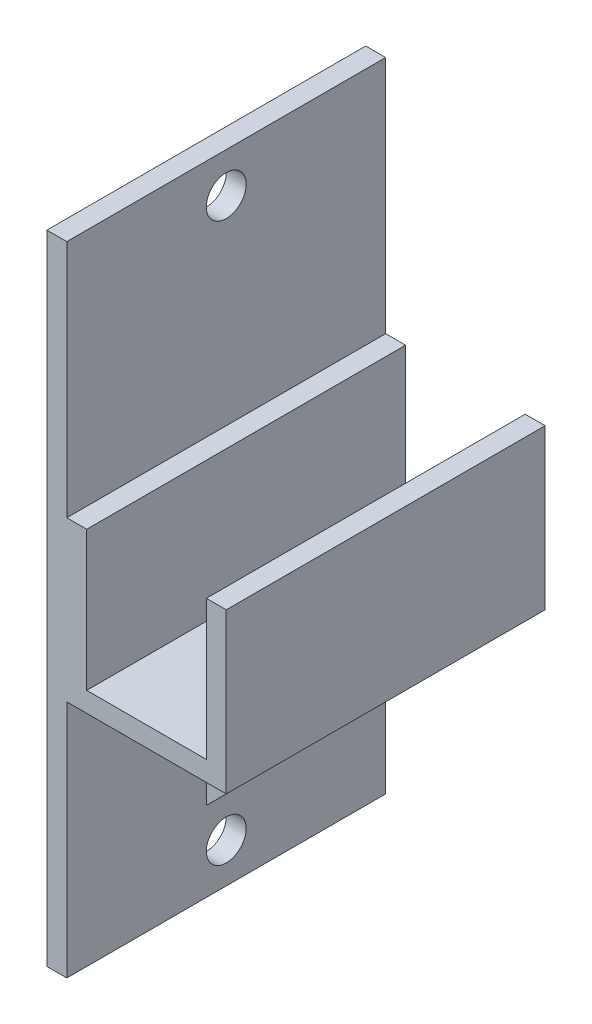
ISO-10303-21;
HEADER;
FILE_DESCRIPTION(('STEP AP214'),'2;1');
FILE_NAME('part.step','',(''),(''),'','','');
FILE_SCHEMA(('AUTOMOTIVE_DESIGN { 1 0 10303 214 1 1 1 1 }'));
ENDSEC;
DATA;
#1=APPLICATION_CONTEXT('core data for automotive mechanical design processes');
#2=APPLICATION_PROTOCOL_DEFINITION('international standard','automotive_design',2000,#1);
#3=PRODUCT_CONTEXT('',#1,'mechanical');
#4=PRODUCT('Part','Part','',(#3));
#5=PRODUCT_RELATED_PRODUCT_CATEGORY('part','',(#4));
#6=PRODUCT_DEFINITION_FORMATION('','',#4);
#7=PRODUCT_DEFINITION_CONTEXT('part definition',#1,'design');
#8=PRODUCT_DEFINITION('design','',#6,#7);
#9=PRODUCT_DEFINITION_SHAPE('','',#8);
#10=(LENGTH_UNIT() NAMED_UNIT(*) SI_UNIT(.MILLI.,.METRE.));
#11=(NAMED_UNIT(*) PLANE_ANGLE_UNIT() SI_UNIT($,.RADIAN.));
#12=(NAMED_UNIT(*) SI_UNIT($,.STERADIAN.) SOLID_ANGLE_UNIT());
#13=UNCERTAINTY_MEASURE_WITH_UNIT(LENGTH_MEASURE(1.E-05),#10,'distance_accuracy_value','');
#14=(GEOMETRIC_REPRESENTATION_CONTEXT(3) GLOBAL_UNCERTAINTY_ASSIGNED_CONTEXT((#13)) GLOBAL_UNIT_ASSIGNED_CONTEXT((#10,
#11,#12)) REPRESENTATION_CONTEXT('',''));
#15=CARTESIAN_POINT('',(0.,0.,0.));
#16=DIRECTION('',(0.,0.,1.));
#17=DIRECTION('',(1.,0.,0.));
#18=AXIS2_PLACEMENT_3D('',#15,#16,#17);
#19=CARTESIAN_POINT('',(0.,0.,50.8));
#20=DIRECTION('',(0.,1.,0.));
#21=DIRECTION('',(0.,0.,1.));
#22=AXIS2_PLACEMENT_3D('',#19,#20,#21);
#23=PLANE('',#22);
#24=DIRECTION('',(1.,0.,0.));
#25=VECTOR('',#24,1.);
#26=CARTESIAN_POINT('',(-12.7,0.,28.575));
#27=LINE('',#26,#25);
#28=CARTESIAN_POINT('',(-12.7,0.,28.575));
#29=VERTEX_POINT('',#28);
#30=CARTESIAN_POINT('',(12.7,0.,28.575));
#31=VERTEX_POINT('',#30);
#32=EDGE_CURVE('E375',#29,#31,#27,.T.);
#33=ORIENTED_EDGE('',*,*,#32,.T.);
#34=DIRECTION('',(0.,0.,-1.));
#35=VECTOR('',#34,1.);
#36=CARTESIAN_POINT('',(12.7,0.,50.8));
#37=LINE('',#36,#35);
#38=CARTESIAN_POINT('',(12.7,0.,50.8));
#39=VERTEX_POINT('',#38);
#40=EDGE_CURVE('E12',#39,#31,#37,.T.);
#41=ORIENTED_EDGE('',*,*,#40,.F.);
#42=DIRECTION('',(1.,0.,0.));
#43=VECTOR('',#42,1.);
#44=CARTESIAN_POINT('',(0.,0.,50.8));
#45=LINE('',#44,#43);
#46=CARTESIAN_POINT('',(-12.7,0.,50.8));
#47=VERTEX_POINT('',#46);
#48=EDGE_CURVE('E99',#47,#39,#45,.T.);
#49=ORIENTED_EDGE('',*,*,#48,.F.);
#50=DIRECTION('',(0.,0.,-1.));
#51=VECTOR('',#50,1.);
#52=CARTESIAN_POINT('',(-12.7,0.,50.8));
#53=LINE('',#52,#51);
#54=EDGE_CURVE('E285',#47,#29,#53,.T.);
#55=ORIENTED_EDGE('',*,*,#54,.T.);
#56=EDGE_LOOP('',(#33,#41,#49,#55));
#57=FACE_BOUND('',#56,.T.);
#58=ADVANCED_FACE('F46',(#57),#23,.F.);
#59=CARTESIAN_POINT('',(-12.7,0.,0.));
#60=DIRECTION('',(-1.,0.,0.));
#61=DIRECTION('',(0.,0.,1.));
#62=AXIS2_PLACEMENT_3D('',#59,#60,#61);
#63=PLANE('',#62);
#64=CARTESIAN_POINT('',(-12.7,-31.75,25.4));
#65=DIRECTION('',(-1.,0.,0.));
#66=DIRECTION('',(0.,0.,1.));
#67=AXIS2_PLACEMENT_3D('',#64,#65,#66);
#68=CIRCLE('',#67,3.175);
#69=CARTESIAN_POINT('',(-12.7,-31.75,28.575));
#70=VERTEX_POINT('',#69);
#71=EDGE_CURVE('E192',#70,#70,#68,.T.);
#72=ORIENTED_EDGE('',*,*,#71,.T.);
#73=EDGE_LOOP('',(#72));
#74=FACE_BOUND('',#73,.T.);
#75=DIRECTION('',(0.,1.,0.));
#76=VECTOR('',#75,1.);
#77=CARTESIAN_POINT('',(-12.7,0.,28.575));
#78=LINE('',#77,#76);
#79=CARTESIAN_POINT('',(-12.7,-25.3999999999997,28.575));
#80=VERTEX_POINT('',#79);
#81=EDGE_CURVE('E188',#80,#29,#78,.T.);
#82=ORIENTED_EDGE('',*,*,#81,.T.);
#83=ORIENTED_EDGE('',*,*,#54,.F.);
#84=DIRECTION('',(0.,1.,0.));
#85=VECTOR('',#84,1.);
#86=CARTESIAN_POINT('',(-12.7,63.5,50.8));
#87=LINE('',#86,#85);
#88=CARTESIAN_POINT('',(-12.7,-38.1,50.8));
#89=VERTEX_POINT('',#88);
#90=EDGE_CURVE('E235',#89,#47,#87,.T.);
#91=ORIENTED_EDGE('',*,*,#90,.F.);
#92=DIRECTION('',(0.,0.,1.));
#93=VECTOR('',#92,1.);
#94=CARTESIAN_POINT('',(-12.7,-38.1,0.));
#95=LINE('',#94,#93);
#96=CARTESIAN_POINT('',(-12.7,-38.1,0.));
#97=VERTEX_POINT('',#96);
#98=EDGE_CURVE('E230',#97,#89,#95,.T.);
#99=ORIENTED_EDGE('',*,*,#98,.F.);
#100=DIRECTION('',(0.,-1.,0.));
#101=VECTOR('',#100,1.);
#102=CARTESIAN_POINT('',(-12.7,63.5,0.));
#103=LINE('',#102,#101);
#104=CARTESIAN_POINT('',(-12.7,0.,0.));
#105=VERTEX_POINT('',#104);
#106=EDGE_CURVE('E210',#105,#97,#103,.T.);
#107=ORIENTED_EDGE('',*,*,#106,.F.);
#108=CARTESIAN_POINT('',(-12.7,0.,22.225));
#109=VERTEX_POINT('',#108);
#110=EDGE_CURVE('E284',#109,#105,#53,.T.);
#111=ORIENTED_EDGE('',*,*,#110,.F.);
#112=DIRECTION('',(0.,1.,0.));
#113=VECTOR('',#112,1.);
#114=CARTESIAN_POINT('',(-12.7,0.,22.225));
#115=LINE('',#114,#113);
#116=CARTESIAN_POINT('',(-12.7,-25.3999999999997,22.225));
#117=VERTEX_POINT('',#116);
#118=EDGE_CURVE('E168',#117,#109,#115,.T.);
#119=ORIENTED_EDGE('',*,*,#118,.F.);
#120=DIRECTION('',(0.,0.,-1.));
#121=VECTOR('',#120,1.);
#122=CARTESIAN_POINT('',(-12.7,-25.3999999999997,28.575));
#123=LINE('',#122,#121);
#124=EDGE_CURVE('E165',#80,#117,#123,.T.);
#125=ORIENTED_EDGE('',*,*,#124,.F.);
#126=EDGE_LOOP('',(#82,#83,#91,#99,#107,#111,#119,#125));
#127=FACE_BOUND('',#126,.T.);
#128=ADVANCED_FACE('F356',(#74,#127),#63,.F.);
#129=CARTESIAN_POINT('',(12.7,0.,22.225));
#130=VERTEX_POINT('',#129);
#131=CARTESIAN_POINT('',(12.7,0.,0.));
#132=VERTEX_POINT('',#131);
#133=EDGE_CURVE('E55',#130,#132,#37,.T.);
#134=ORIENTED_EDGE('',*,*,#133,.F.);
#135=DIRECTION('',(1.,0.,0.));
#136=VECTOR('',#135,1.);
#137=CARTESIAN_POINT('',(-12.7,0.,22.225));
#138=LINE('',#137,#136);
#139=EDGE_CURVE('E169',#109,#130,#138,.T.);
#140=ORIENTED_EDGE('',*,*,#139,.F.);
#141=ORIENTED_EDGE('',*,*,#110,.T.);
#142=DIRECTION('',(1.,0.,0.));
#143=VECTOR('',#142,1.);
#144=CARTESIAN_POINT('',(0.,0.,0.));
#145=LINE('',#144,#143);
#146=EDGE_CURVE('E180',#105,#132,#145,.T.);
#147=ORIENTED_EDGE('',*,*,#146,.T.);
#148=EDGE_LOOP('',(#134,#140,#141,#147));
#149=FACE_BOUND('',#148,.T.);
#150=ADVANCED_FACE('F48',(#149),#23,.F.);
#151=CARTESIAN_POINT('',(12.7,0.,50.8));
#152=DIRECTION('',(-1.,0.,0.));
#153=DIRECTION('',(0.,0.,1.));
#154=AXIS2_PLACEMENT_3D('',#151,#152,#153);
#155=PLANE('',#154);
#156=DIRECTION('',(0.,1.,0.));
#157=VECTOR('',#156,1.);
#158=CARTESIAN_POINT('',(12.7,0.,0.));
#159=LINE('',#158,#157);
#160=CARTESIAN_POINT('',(12.7,25.4,0.));
#161=VERTEX_POINT('',#160);
#162=EDGE_CURVE('E306',#132,#161,#159,.T.);
#163=ORIENTED_EDGE('',*,*,#162,.T.);
#164=DIRECTION('',(0.,0.,-1.));
#165=VECTOR('',#164,1.);
#166=CARTESIAN_POINT('',(12.7,25.4,50.8));
#167=LINE('',#166,#165);
#168=CARTESIAN_POINT('',(12.7,25.4,50.8));
#169=VERTEX_POINT('',#168);
#170=EDGE_CURVE('E184',#169,#161,#167,.T.);
#171=ORIENTED_EDGE('',*,*,#170,.F.);
#172=DIRECTION('',(0.,1.,0.));
#173=VECTOR('',#172,1.);
#174=CARTESIAN_POINT('',(12.7,0.,50.8));
#175=LINE('',#174,#173);
#176=EDGE_CURVE('E291',#39,#169,#175,.T.);
#177=ORIENTED_EDGE('',*,*,#176,.F.);
#178=ORIENTED_EDGE('',*,*,#40,.T.);
#179=DIRECTION('',(0.,0.,-1.));
#180=VECTOR('',#179,1.);
#181=CARTESIAN_POINT('',(12.7,0.,28.575));
#182=LINE('',#181,#180);
#183=EDGE_CURVE('E162',#31,#130,#182,.T.);
#184=ORIENTED_EDGE('',*,*,#183,.T.);
#185=ORIENTED_EDGE('',*,*,#133,.T.);
#186=EDGE_LOOP('',(#163,#171,#177,#178,#184,#185));
#187=FACE_BOUND('',#186,.T.);
#188=ADVANCED_FACE('F185',(#187),#155,.F.);
#189=CARTESIAN_POINT('',(12.7,25.4,50.8));
#190=DIRECTION('',(0.,-1.,0.));
#191=DIRECTION('',(0.,0.,-1.));
#192=AXIS2_PLACEMENT_3D('',#189,#190,#191);
#193=PLANE('',#192);
#194=DIRECTION('',(-1.,0.,0.));
#195=VECTOR('',#194,1.);
#196=CARTESIAN_POINT('',(12.7,25.4,0.));
#197=LINE('',#196,#195);
#198=CARTESIAN_POINT('',(9.525,25.4,0.));
#199=VERTEX_POINT('',#198);
#200=EDGE_CURVE('E309',#161,#199,#197,.T.);
#201=ORIENTED_EDGE('',*,*,#200,.T.);
#202=DIRECTION('',(0.,0.,-1.));
#203=VECTOR('',#202,1.);
#204=CARTESIAN_POINT('',(9.525,25.4,50.8));
#205=LINE('',#204,#203);
#206=CARTESIAN_POINT('',(9.525,25.4,50.8));
#207=VERTEX_POINT('',#206);
#208=EDGE_CURVE('E318',#207,#199,#205,.T.);
#209=ORIENTED_EDGE('',*,*,#208,.F.);
#210=DIRECTION('',(-1.,0.,0.));
#211=VECTOR('',#210,1.);
#212=CARTESIAN_POINT('',(12.7,25.4,50.8));
#213=LINE('',#212,#211);
#214=EDGE_CURVE('E295',#169,#207,#213,.T.);
#215=ORIENTED_EDGE('',*,*,#214,.F.);
#216=ORIENTED_EDGE('',*,*,#170,.T.);
#217=EDGE_LOOP('',(#201,#209,#215,#216));
#218=FACE_BOUND('',#217,.T.);
#219=ADVANCED_FACE('F326',(#218),#193,.F.);
#220=CARTESIAN_POINT('',(9.525,25.4,50.8));
#221=DIRECTION('',(1.,0.,0.));
#222=DIRECTION('',(0.,1.,0.));
#223=AXIS2_PLACEMENT_3D('',#220,#221,#222);
#224=PLANE('',#223);
#225=DIRECTION('',(0.,-1.,0.));
#226=VECTOR('',#225,1.);
#227=CARTESIAN_POINT('',(9.525,25.4,0.));
#228=LINE('',#227,#226);
#229=CARTESIAN_POINT('',(9.52500000000001,3.175,0.));
#230=VERTEX_POINT('',#229);
#231=EDGE_CURVE('E92',#199,#230,#228,.T.);
#232=ORIENTED_EDGE('',*,*,#231,.T.);
#233=DIRECTION('',(0.,0.,-1.));
#234=VECTOR('',#233,1.);
#235=CARTESIAN_POINT('',(9.52500000000001,3.175,50.8));
#236=LINE('',#235,#234);
#237=CARTESIAN_POINT('',(9.52500000000001,3.175,50.8));
#238=VERTEX_POINT('',#237);
#239=EDGE_CURVE('E303',#238,#230,#236,.T.);
#240=ORIENTED_EDGE('',*,*,#239,.F.);
#241=DIRECTION('',(0.,-1.,0.));
#242=VECTOR('',#241,1.);
#243=CARTESIAN_POINT('',(9.525,25.4,50.8));
#244=LINE('',#243,#242);
#245=EDGE_CURVE('E71',#207,#238,#244,.T.);
#246=ORIENTED_EDGE('',*,*,#245,.F.);
#247=ORIENTED_EDGE('',*,*,#208,.T.);
#248=EDGE_LOOP('',(#232,#240,#246,#247));
#249=FACE_BOUND('',#248,.T.);
#250=ADVANCED_FACE('F386',(#249),#224,.F.);
#251=CARTESIAN_POINT('',(9.52500000000001,3.175,50.8));
#252=DIRECTION('',(0.,-1.,0.));
#253=DIRECTION('',(1.,0.,0.));
#254=AXIS2_PLACEMENT_3D('',#251,#252,#253);
#255=PLANE('',#254);
#256=DIRECTION('',(-1.,0.,0.));
#257=VECTOR('',#256,1.);
#258=CARTESIAN_POINT('',(9.52500000000001,3.175,0.));
#259=LINE('',#258,#257);
#260=CARTESIAN_POINT('',(-9.52500000000001,3.175,0.));
#261=VERTEX_POINT('',#260);
#262=EDGE_CURVE('E292',#230,#261,#259,.T.);
#263=ORIENTED_EDGE('',*,*,#262,.T.);
#264=DIRECTION('',(0.,0.,-1.));
#265=VECTOR('',#264,1.);
#266=CARTESIAN_POINT('',(-9.52500000000001,3.175,50.8));
#267=LINE('',#266,#265);
#268=CARTESIAN_POINT('',(-9.52500000000001,3.175,50.8));
#269=VERTEX_POINT('',#268);
#270=EDGE_CURVE('E266',#269,#261,#267,.T.);
#271=ORIENTED_EDGE('',*,*,#270,.F.);
#272=DIRECTION('',(-1.,0.,0.));
#273=VECTOR('',#272,1.);
#274=CARTESIAN_POINT('',(9.52500000000001,3.175,50.8));
#275=LINE('',#274,#273);
#276=EDGE_CURVE('E300',#238,#269,#275,.T.);
#277=ORIENTED_EDGE('',*,*,#276,.F.);
#278=ORIENTED_EDGE('',*,*,#239,.T.);
#279=EDGE_LOOP('',(#263,#271,#277,#278));
#280=FACE_BOUND('',#279,.T.);
#281=ADVANCED_FACE('F333',(#280),#255,.F.);
#282=CARTESIAN_POINT('',(0.,0.,50.8));
#283=DIRECTION('',(0.,0.,1.));
#284=DIRECTION('',(1.,0.,0.));
#285=AXIS2_PLACEMENT_3D('',#282,#283,#284);
#286=PLANE('',#285);
#287=ORIENTED_EDGE('',*,*,#276,.T.);
#288=DIRECTION('',(0.,-1.,0.));
#289=VECTOR('',#288,1.);
#290=CARTESIAN_POINT('',(-9.525,25.4,50.8));
#291=LINE('',#290,#289);
#292=CARTESIAN_POINT('',(-9.525,25.4,50.8));
#293=VERTEX_POINT('',#292);
#294=EDGE_CURVE('E261',#293,#269,#291,.T.);
#295=ORIENTED_EDGE('',*,*,#294,.F.);
#296=DIRECTION('',(1.,0.,0.));
#297=VECTOR('',#296,1.);
#298=CARTESIAN_POINT('',(-12.7,25.4,50.8));
#299=LINE('',#298,#297);
#300=CARTESIAN_POINT('',(-12.7,25.4,50.8));
#301=VERTEX_POINT('',#300);
#302=EDGE_CURVE('E257',#301,#293,#299,.T.);
#303=ORIENTED_EDGE('',*,*,#302,.F.);
#304=CARTESIAN_POINT('',(-12.7,63.5,50.8));
#305=VERTEX_POINT('',#304);
#306=EDGE_CURVE('E234',#301,#305,#87,.T.);
#307=ORIENTED_EDGE('',*,*,#306,.T.);
#308=DIRECTION('',(1.,0.,0.));
#309=VECTOR('',#308,1.);
#310=CARTESIAN_POINT('',(-15.875,63.5,50.8));
#311=LINE('',#310,#309);
#312=CARTESIAN_POINT('',(-15.875,63.5,50.8));
#313=VERTEX_POINT('',#312);
#314=EDGE_CURVE('E244',#313,#305,#311,.T.);
#315=ORIENTED_EDGE('',*,*,#314,.F.);
#316=DIRECTION('',(0.,1.,0.));
#317=VECTOR('',#316,1.);
#318=CARTESIAN_POINT('',(-15.875,63.5,50.8));
#319=LINE('',#318,#317);
#320=CARTESIAN_POINT('',(-15.875,-38.1,50.8));
#321=VERTEX_POINT('',#320);
#322=EDGE_CURVE('E364',#321,#313,#319,.T.);
#323=ORIENTED_EDGE('',*,*,#322,.F.);
#324=DIRECTION('',(1.,0.,0.));
#325=VECTOR('',#324,1.);
#326=CARTESIAN_POINT('',(-15.875,-38.1,50.8));
#327=LINE('',#326,#325);
#328=EDGE_CURVE('E248',#321,#89,#327,.T.);
#329=ORIENTED_EDGE('',*,*,#328,.T.);
#330=ORIENTED_EDGE('',*,*,#90,.T.);
#331=ORIENTED_EDGE('',*,*,#48,.T.);
#332=ORIENTED_EDGE('',*,*,#176,.T.);
#333=ORIENTED_EDGE('',*,*,#214,.T.);
#334=ORIENTED_EDGE('',*,*,#245,.T.);
#335=EDGE_LOOP('',(#287,#295,#303,#307,#315,#323,#329,#330,#331,#332,#333,#334));
#336=FACE_BOUND('',#335,.T.);
#337=ADVANCED_FACE('F338',(#336),#286,.T.);
#338=CARTESIAN_POINT('',(0.,0.,0.));
#339=DIRECTION('',(0.,0.,1.));
#340=DIRECTION('',(1.,0.,0.));
#341=AXIS2_PLACEMENT_3D('',#338,#339,#340);
#342=PLANE('',#341);
#343=ORIENTED_EDGE('',*,*,#146,.F.);
#344=ORIENTED_EDGE('',*,*,#106,.T.);
#345=DIRECTION('',(1.,0.,0.));
#346=VECTOR('',#345,1.);
#347=CARTESIAN_POINT('',(-15.875,-38.1,0.));
#348=LINE('',#347,#346);
#349=CARTESIAN_POINT('',(-15.875,-38.1,0.));
#350=VERTEX_POINT('',#349);
#351=EDGE_CURVE('E252',#350,#97,#348,.T.);
#352=ORIENTED_EDGE('',*,*,#351,.F.);
#353=DIRECTION('',(0.,-1.,0.));
#354=VECTOR('',#353,1.);
#355=CARTESIAN_POINT('',(-15.875,63.5,0.));
#356=LINE('',#355,#354);
#357=CARTESIAN_POINT('',(-15.875,63.5,0.));
#358=VERTEX_POINT('',#357);
#359=EDGE_CURVE('E214',#358,#350,#356,.T.);
#360=ORIENTED_EDGE('',*,*,#359,.F.);
#361=DIRECTION('',(1.,0.,0.));
#362=VECTOR('',#361,1.);
#363=CARTESIAN_POINT('',(-15.875,63.5,0.));
#364=LINE('',#363,#362);
#365=CARTESIAN_POINT('',(-12.7,63.5,0.));
#366=VERTEX_POINT('',#365);
#367=EDGE_CURVE('E240',#358,#366,#364,.T.);
#368=ORIENTED_EDGE('',*,*,#367,.T.);
#369=CARTESIAN_POINT('',(-12.7,25.4,0.));
#370=VERTEX_POINT('',#369);
#371=EDGE_CURVE('E224',#366,#370,#103,.T.);
#372=ORIENTED_EDGE('',*,*,#371,.T.);
#373=DIRECTION('',(1.,0.,0.));
#374=VECTOR('',#373,1.);
#375=CARTESIAN_POINT('',(-12.7,25.4,0.));
#376=LINE('',#375,#374);
#377=CARTESIAN_POINT('',(-9.525,25.4,0.));
#378=VERTEX_POINT('',#377);
#379=EDGE_CURVE('E256',#370,#378,#376,.T.);
#380=ORIENTED_EDGE('',*,*,#379,.T.);
#381=DIRECTION('',(0.,-1.,0.));
#382=VECTOR('',#381,1.);
#383=CARTESIAN_POINT('',(-9.525,25.4,0.));
#384=LINE('',#383,#382);
#385=EDGE_CURVE('E262',#378,#261,#384,.T.);
#386=ORIENTED_EDGE('',*,*,#385,.T.);
#387=ORIENTED_EDGE('',*,*,#262,.F.);
#388=ORIENTED_EDGE('',*,*,#231,.F.);
#389=ORIENTED_EDGE('',*,*,#200,.F.);
#390=ORIENTED_EDGE('',*,*,#162,.F.);
#391=EDGE_LOOP('',(#343,#344,#352,#360,#368,#372,#380,#386,#387,#388,#389,#390));
#392=FACE_BOUND('',#391,.T.);
#393=ADVANCED_FACE('F329',(#392),#342,.F.);
#394=CARTESIAN_POINT('',(-12.7,25.4,50.8));
#395=DIRECTION('',(0.,-1.,0.));
#396=DIRECTION('',(0.,0.,-1.));
#397=AXIS2_PLACEMENT_3D('',#394,#395,#396);
#398=PLANE('',#397);
#399=ORIENTED_EDGE('',*,*,#379,.F.);
#400=DIRECTION('',(0.,0.,-1.));
#401=VECTOR('',#400,1.);
#402=CARTESIAN_POINT('',(-12.7,25.4,50.8));
#403=LINE('',#402,#401);
#404=EDGE_CURVE('E279',#301,#370,#403,.T.);
#405=ORIENTED_EDGE('',*,*,#404,.F.);
#406=ORIENTED_EDGE('',*,*,#302,.T.);
#407=DIRECTION('',(0.,0.,-1.));
#408=VECTOR('',#407,1.);
#409=CARTESIAN_POINT('',(-9.525,25.4,50.8));
#410=LINE('',#409,#408);
#411=EDGE_CURVE('E276',#293,#378,#410,.T.);
#412=ORIENTED_EDGE('',*,*,#411,.T.);
#413=EDGE_LOOP('',(#399,#405,#406,#412));
#414=FACE_BOUND('',#413,.T.);
#415=ADVANCED_FACE('F343',(#414),#398,.F.);
#416=CARTESIAN_POINT('',(-9.525,25.4,50.8));
#417=DIRECTION('',(-1.,0.,0.));
#418=DIRECTION('',(0.,1.,0.));
#419=AXIS2_PLACEMENT_3D('',#416,#417,#418);
#420=PLANE('',#419);
#421=ORIENTED_EDGE('',*,*,#385,.F.);
#422=ORIENTED_EDGE('',*,*,#411,.F.);
#423=ORIENTED_EDGE('',*,*,#294,.T.);
#424=ORIENTED_EDGE('',*,*,#270,.T.);
#425=EDGE_LOOP('',(#421,#422,#423,#424));
#426=FACE_BOUND('',#425,.T.);
#427=ADVANCED_FACE('F336',(#426),#420,.F.);
#428=CARTESIAN_POINT('',(-12.7,57.15,25.4));
#429=DIRECTION('',(-1.,0.,0.));
#430=DIRECTION('',(0.,0.,1.));
#431=AXIS2_PLACEMENT_3D('',#428,#429,#430);
#432=CIRCLE('',#431,3.175);
#433=CARTESIAN_POINT('',(-12.7,57.15,28.575));
#434=VERTEX_POINT('',#433);
#435=EDGE_CURVE('E202',#434,#434,#432,.T.);
#436=ORIENTED_EDGE('',*,*,#435,.T.);
#437=EDGE_LOOP('',(#436));
#438=FACE_BOUND('',#437,.T.);
#439=ORIENTED_EDGE('',*,*,#306,.F.);
#440=ORIENTED_EDGE('',*,*,#404,.T.);
#441=ORIENTED_EDGE('',*,*,#371,.F.);
#442=DIRECTION('',(0.,0.,-1.));
#443=VECTOR('',#442,1.);
#444=CARTESIAN_POINT('',(-12.7,63.5,0.));
#445=LINE('',#444,#443);
#446=EDGE_CURVE('E220',#305,#366,#445,.T.);
#447=ORIENTED_EDGE('',*,*,#446,.F.);
#448=EDGE_LOOP('',(#439,#440,#441,#447));
#449=FACE_BOUND('',#448,.T.);
#450=ADVANCED_FACE('F347',(#438,#449),#63,.F.);
#451=CARTESIAN_POINT('',(-15.875,0.,0.));
#452=DIRECTION('',(-1.,0.,0.));
#453=DIRECTION('',(0.,0.,1.));
#454=AXIS2_PLACEMENT_3D('',#451,#452,#453);
#455=PLANE('',#454);
#456=CARTESIAN_POINT('',(-15.875,57.15,25.4));
#457=DIRECTION('',(-1.,0.,0.));
#458=DIRECTION('',(0.,0.,1.));
#459=AXIS2_PLACEMENT_3D('',#456,#457,#458);
#460=CIRCLE('',#459,3.175);
#461=CARTESIAN_POINT('',(-15.875,57.15,28.575));
#462=VERTEX_POINT('',#461);
#463=EDGE_CURVE('E206',#462,#462,#460,.T.);
#464=ORIENTED_EDGE('',*,*,#463,.F.);
#465=EDGE_LOOP('',(#464));
#466=FACE_BOUND('',#465,.T.);
#467=ORIENTED_EDGE('',*,*,#359,.T.);
#468=DIRECTION('',(0.,0.,1.));
#469=VECTOR('',#468,1.);
#470=CARTESIAN_POINT('',(-15.875,-38.1,0.));
#471=LINE('',#470,#469);
#472=EDGE_CURVE('E219',#350,#321,#471,.T.);
#473=ORIENTED_EDGE('',*,*,#472,.T.);
#474=ORIENTED_EDGE('',*,*,#322,.T.);
#475=DIRECTION('',(0.,0.,-1.));
#476=VECTOR('',#475,1.);
#477=CARTESIAN_POINT('',(-15.875,63.5,0.));
#478=LINE('',#477,#476);
#479=EDGE_CURVE('E231',#313,#358,#478,.T.);
#480=ORIENTED_EDGE('',*,*,#479,.T.);
#481=EDGE_LOOP('',(#467,#473,#474,#480));
#482=FACE_BOUND('',#481,.T.);
#483=CARTESIAN_POINT('',(-15.875,-31.75,25.4));
#484=DIRECTION('',(-1.,0.,0.));
#485=DIRECTION('',(0.,0.,1.));
#486=AXIS2_PLACEMENT_3D('',#483,#484,#485);
#487=CIRCLE('',#486,3.175);
#488=CARTESIAN_POINT('',(-15.875,-31.75,28.575));
#489=VERTEX_POINT('',#488);
#490=EDGE_CURVE('E198',#489,#489,#487,.T.);
#491=ORIENTED_EDGE('',*,*,#490,.F.);
#492=EDGE_LOOP('',(#491));
#493=FACE_BOUND('',#492,.T.);
#494=ADVANCED_FACE('F365',(#466,#482,#493),#455,.T.);
#495=CARTESIAN_POINT('',(-15.875,-38.1,0.));
#496=DIRECTION('',(0.,1.,0.));
#497=DIRECTION('',(0.,0.,1.));
#498=AXIS2_PLACEMENT_3D('',#495,#496,#497);
#499=PLANE('',#498);
#500=ORIENTED_EDGE('',*,*,#98,.T.);
#501=ORIENTED_EDGE('',*,*,#328,.F.);
#502=ORIENTED_EDGE('',*,*,#472,.F.);
#503=ORIENTED_EDGE('',*,*,#351,.T.);
#504=EDGE_LOOP('',(#500,#501,#502,#503));
#505=FACE_BOUND('',#504,.T.);
#506=ADVANCED_FACE('F360',(#505),#499,.F.);
#507=CARTESIAN_POINT('',(-15.875,63.5,0.));
#508=DIRECTION('',(0.,-1.,0.));
#509=DIRECTION('',(0.,0.,-1.));
#510=AXIS2_PLACEMENT_3D('',#507,#508,#509);
#511=PLANE('',#510);
#512=ORIENTED_EDGE('',*,*,#446,.T.);
#513=ORIENTED_EDGE('',*,*,#367,.F.);
#514=ORIENTED_EDGE('',*,*,#479,.F.);
#515=ORIENTED_EDGE('',*,*,#314,.T.);
#516=EDGE_LOOP('',(#512,#513,#514,#515));
#517=FACE_BOUND('',#516,.T.);
#518=ADVANCED_FACE('F370',(#517),#511,.F.);
#519=CARTESIAN_POINT('',(-15.875,57.15,25.4));
#520=DIRECTION('',(1.,0.,0.));
#521=DIRECTION('',(0.,0.,-1.));
#522=AXIS2_PLACEMENT_3D('',#519,#520,#521);
#523=CYLINDRICAL_SURFACE('',#522,3.175);
#524=ORIENTED_EDGE('',*,*,#463,.T.);
#525=EDGE_LOOP('',(#524));
#526=FACE_BOUND('',#525,.T.);
#527=ORIENTED_EDGE('',*,*,#435,.F.);
#528=EDGE_LOOP('',(#527));
#529=FACE_BOUND('',#528,.T.);
#530=ADVANCED_FACE('F497',(#526,#529),#523,.F.);
#531=CARTESIAN_POINT('',(-15.875,-31.75,25.4));
#532=DIRECTION('',(1.,0.,0.));
#533=DIRECTION('',(0.,0.,-1.));
#534=AXIS2_PLACEMENT_3D('',#531,#532,#533);
#535=CYLINDRICAL_SURFACE('',#534,3.175);
#536=ORIENTED_EDGE('',*,*,#490,.T.);
#537=EDGE_LOOP('',(#536));
#538=FACE_BOUND('',#537,.T.);
#539=ORIENTED_EDGE('',*,*,#71,.F.);
#540=EDGE_LOOP('',(#539));
#541=FACE_BOUND('',#540,.T.);
#542=ADVANCED_FACE('F505',(#538,#541),#535,.F.);
#543=CARTESIAN_POINT('',(12.7,0.,28.575));
#544=DIRECTION('',(0.707106781186543,-0.707106781186551,0.));
#545=DIRECTION('',(0.707106781186552,0.707106781186544,0.));
#546=AXIS2_PLACEMENT_3D('',#543,#544,#545);
#547=PLANE('',#546);
#548=ORIENTED_EDGE('',*,*,#124,.T.);
#549=DIRECTION('',(-0.707106781186551,-0.707106781186543,0.));
#550=VECTOR('',#549,1.);
#551=CARTESIAN_POINT('',(12.7,0.,22.225));
#552=LINE('',#551,#550);
#553=EDGE_CURVE('E62',#130,#117,#552,.T.);
#554=ORIENTED_EDGE('',*,*,#553,.F.);
#555=ORIENTED_EDGE('',*,*,#183,.F.);
#556=DIRECTION('',(-0.707106781186551,-0.707106781186543,0.));
#557=VECTOR('',#556,1.);
#558=CARTESIAN_POINT('',(12.7,0.,28.575));
#559=LINE('',#558,#557);
#560=EDGE_CURVE('E195',#31,#80,#559,.T.);
#561=ORIENTED_EDGE('',*,*,#560,.T.);
#562=EDGE_LOOP('',(#548,#554,#555,#561));
#563=FACE_BOUND('',#562,.T.);
#564=ADVANCED_FACE('F160',(#563),#547,.T.);
#565=CARTESIAN_POINT('',(0.,0.,28.575));
#566=DIRECTION('',(0.,0.,-1.));
#567=DIRECTION('',(-1.,0.,0.));
#568=AXIS2_PLACEMENT_3D('',#565,#566,#567);
#569=PLANE('',#568);
#570=ORIENTED_EDGE('',*,*,#32,.F.);
#571=ORIENTED_EDGE('',*,*,#81,.F.);
#572=ORIENTED_EDGE('',*,*,#560,.F.);
#573=EDGE_LOOP('',(#570,#571,#572));
#574=FACE_BOUND('',#573,.T.);
#575=ADVANCED_FACE('F384',(#574),#569,.F.);
#576=CARTESIAN_POINT('',(0.,0.,22.225));
#577=DIRECTION('',(0.,0.,-1.));
#578=DIRECTION('',(-1.,0.,0.));
#579=AXIS2_PLACEMENT_3D('',#576,#577,#578);
#580=PLANE('',#579);
#581=ORIENTED_EDGE('',*,*,#139,.T.);
#582=ORIENTED_EDGE('',*,*,#553,.T.);
#583=ORIENTED_EDGE('',*,*,#118,.T.);
#584=EDGE_LOOP('',(#581,#582,#583));
#585=FACE_BOUND('',#584,.T.);
#586=ADVANCED_FACE('F173',(#585),#580,.T.);
#587=CLOSED_SHELL('',(#58,#128,#150,#188,#219,#250,#281,#337,#393,#415,#427,#450,#494,#506,#518,
#530,#542,#564,#575,#586));
#588=MANIFOLD_SOLID_BREP('B2',#587);
#589=ADVANCED_BREP_SHAPE_REPRESENTATION('',(#18,#588),#14);
#590=SHAPE_DEFINITION_REPRESENTATION(#9,#589);
ENDSEC;
END-ISO-10303-21;
